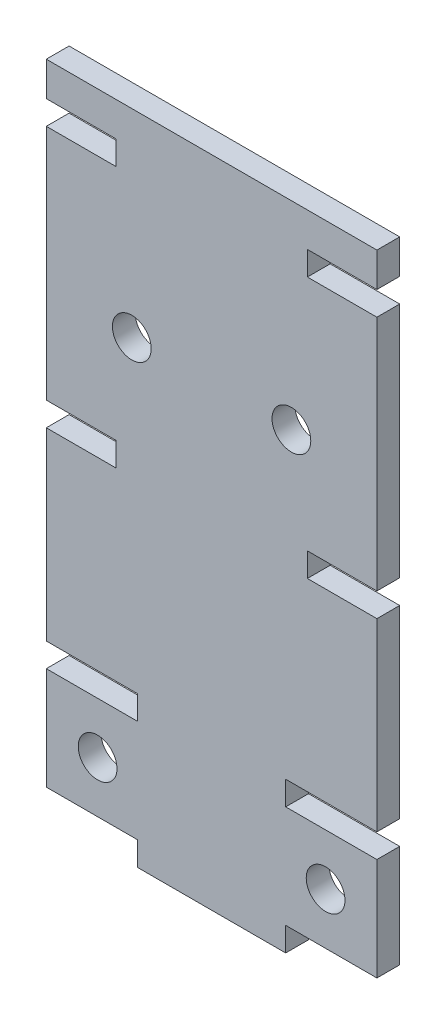
ISO-10303-21;
HEADER;
FILE_DESCRIPTION(('STEP AP214'),'2;1');
FILE_NAME('part.step','',(''),(''),'','','');
FILE_SCHEMA(('AUTOMOTIVE_DESIGN { 1 0 10303 214 1 1 1 1 }'));
ENDSEC;
DATA;
#1=APPLICATION_CONTEXT('core data for automotive mechanical design processes');
#2=APPLICATION_PROTOCOL_DEFINITION('international standard','automotive_design',2000,#1);
#3=PRODUCT_CONTEXT('',#1,'mechanical');
#4=PRODUCT('Part','Part','',(#3));
#5=PRODUCT_RELATED_PRODUCT_CATEGORY('part','',(#4));
#6=PRODUCT_DEFINITION_FORMATION('','',#4);
#7=PRODUCT_DEFINITION_CONTEXT('part definition',#1,'design');
#8=PRODUCT_DEFINITION('design','',#6,#7);
#9=PRODUCT_DEFINITION_SHAPE('','',#8);
#10=(LENGTH_UNIT() NAMED_UNIT(*) SI_UNIT(.MILLI.,.METRE.));
#11=(NAMED_UNIT(*) PLANE_ANGLE_UNIT() SI_UNIT($,.RADIAN.));
#12=(NAMED_UNIT(*) SI_UNIT($,.STERADIAN.) SOLID_ANGLE_UNIT());
#13=UNCERTAINTY_MEASURE_WITH_UNIT(LENGTH_MEASURE(1.E-05),#10,'distance_accuracy_value','');
#14=(GEOMETRIC_REPRESENTATION_CONTEXT(3) GLOBAL_UNCERTAINTY_ASSIGNED_CONTEXT((#13)) GLOBAL_UNIT_ASSIGNED_CONTEXT((#10,
#11,#12)) REPRESENTATION_CONTEXT('',''));
#15=CARTESIAN_POINT('',(0.,0.,0.));
#16=DIRECTION('',(0.,0.,1.));
#17=DIRECTION('',(1.,0.,0.));
#18=AXIS2_PLACEMENT_3D('',#15,#16,#17);
#19=CARTESIAN_POINT('',(0.,39.1,2.));
#20=DIRECTION('',(0.,-1.,0.));
#21=DIRECTION('',(1.,0.,0.));
#22=AXIS2_PLACEMENT_3D('',#19,#20,#21);
#23=PLANE('',#22);
#24=DIRECTION('',(0.,0.,1.));
#25=VECTOR('',#24,1.);
#26=CARTESIAN_POINT('',(6.09999999999999,39.1,0.));
#27=LINE('',#26,#25);
#28=CARTESIAN_POINT('',(6.09999999999999,39.1,0.));
#29=VERTEX_POINT('',#28);
#30=CARTESIAN_POINT('',(6.09999999999999,39.1,2.));
#31=VERTEX_POINT('',#30);
#32=EDGE_CURVE('E317',#29,#31,#27,.T.);
#33=ORIENTED_EDGE('',*,*,#32,.F.);
#34=DIRECTION('',(-1.,0.,0.));
#35=VECTOR('',#34,1.);
#36=CARTESIAN_POINT('',(0.,39.1,0.));
#37=LINE('',#36,#35);
#38=CARTESIAN_POINT('',(0.,39.1,0.));
#39=VERTEX_POINT('',#38);
#40=EDGE_CURVE('E280',#29,#39,#37,.T.);
#41=ORIENTED_EDGE('',*,*,#40,.T.);
#42=DIRECTION('',(0.,0.,-1.));
#43=VECTOR('',#42,1.);
#44=CARTESIAN_POINT('',(0.,39.1,2.));
#45=LINE('',#44,#43);
#46=CARTESIAN_POINT('',(0.,39.1,2.));
#47=VERTEX_POINT('',#46);
#48=EDGE_CURVE('E288',#47,#39,#45,.T.);
#49=ORIENTED_EDGE('',*,*,#48,.F.);
#50=DIRECTION('',(-1.,0.,0.));
#51=VECTOR('',#50,1.);
#52=CARTESIAN_POINT('',(0.,39.1,2.));
#53=LINE('',#52,#51);
#54=EDGE_CURVE('E461',#31,#47,#53,.T.);
#55=ORIENTED_EDGE('',*,*,#54,.F.);
#56=EDGE_LOOP('',(#33,#41,#49,#55));
#57=FACE_BOUND('',#56,.T.);
#58=ADVANCED_FACE('F42',(#57),#23,.F.);
#59=CARTESIAN_POINT('',(0.,0.,2.));
#60=DIRECTION('',(1.,0.,0.));
#61=DIRECTION('',(0.,1.,0.));
#62=AXIS2_PLACEMENT_3D('',#59,#60,#61);
#63=PLANE('',#62);
#64=DIRECTION('',(0.,-1.,0.));
#65=VECTOR('',#64,1.);
#66=CARTESIAN_POINT('',(0.,0.,2.));
#67=LINE('',#66,#65);
#68=CARTESIAN_POINT('',(0.,16.2,2.));
#69=VERTEX_POINT('',#68);
#70=CARTESIAN_POINT('',(0.,0.,2.));
#71=VERTEX_POINT('',#70);
#72=EDGE_CURVE('E279',#69,#71,#67,.T.);
#73=ORIENTED_EDGE('',*,*,#72,.F.);
#74=DIRECTION('',(0.,0.,1.));
#75=VECTOR('',#74,1.);
#76=CARTESIAN_POINT('',(0.,16.2,0.));
#77=LINE('',#76,#75);
#78=CARTESIAN_POINT('',(0.,16.2,0.));
#79=VERTEX_POINT('',#78);
#80=EDGE_CURVE('E422',#79,#69,#77,.T.);
#81=ORIENTED_EDGE('',*,*,#80,.F.);
#82=DIRECTION('',(0.,-1.,0.));
#83=VECTOR('',#82,1.);
#84=CARTESIAN_POINT('',(0.,0.,0.));
#85=LINE('',#84,#83);
#86=CARTESIAN_POINT('',(0.,0.,0.));
#87=VERTEX_POINT('',#86);
#88=EDGE_CURVE('E421',#79,#87,#85,.T.);
#89=ORIENTED_EDGE('',*,*,#88,.T.);
#90=DIRECTION('',(0.,0.,-1.));
#91=VECTOR('',#90,1.);
#92=CARTESIAN_POINT('',(0.,0.,2.));
#93=LINE('',#92,#91);
#94=EDGE_CURVE('E11',#71,#87,#93,.T.);
#95=ORIENTED_EDGE('',*,*,#94,.F.);
#96=EDGE_LOOP('',(#73,#81,#89,#95));
#97=FACE_BOUND('',#96,.T.);
#98=ADVANCED_FACE('F514',(#97),#63,.F.);
#99=CARTESIAN_POINT('',(29.,0.,2.));
#100=DIRECTION('',(-1.,0.,0.));
#101=DIRECTION('',(0.,0.,1.));
#102=AXIS2_PLACEMENT_3D('',#99,#100,#101);
#103=PLANE('',#102);
#104=DIRECTION('',(0.,1.,0.));
#105=VECTOR('',#104,1.);
#106=CARTESIAN_POINT('',(29.,0.,2.));
#107=LINE('',#106,#105);
#108=CARTESIAN_POINT('',(29.,18.3,2.));
#109=VERTEX_POINT('',#108);
#110=CARTESIAN_POINT('',(29.,39.1,2.));
#111=VERTEX_POINT('',#110);
#112=EDGE_CURVE('E462',#109,#111,#107,.T.);
#113=ORIENTED_EDGE('',*,*,#112,.F.);
#114=DIRECTION('',(0.,0.,1.));
#115=VECTOR('',#114,1.);
#116=CARTESIAN_POINT('',(29.,18.3,0.));
#117=LINE('',#116,#115);
#118=CARTESIAN_POINT('',(29.,18.3,0.));
#119=VERTEX_POINT('',#118);
#120=EDGE_CURVE('E385',#119,#109,#117,.T.);
#121=ORIENTED_EDGE('',*,*,#120,.F.);
#122=DIRECTION('',(0.,1.,0.));
#123=VECTOR('',#122,1.);
#124=CARTESIAN_POINT('',(29.,0.,0.));
#125=LINE('',#124,#123);
#126=CARTESIAN_POINT('',(29.,39.1,0.));
#127=VERTEX_POINT('',#126);
#128=EDGE_CURVE('E475',#119,#127,#125,.T.);
#129=ORIENTED_EDGE('',*,*,#128,.T.);
#130=DIRECTION('',(0.,0.,-1.));
#131=VECTOR('',#130,1.);
#132=CARTESIAN_POINT('',(29.,39.1,2.));
#133=LINE('',#132,#131);
#134=EDGE_CURVE('E278',#111,#127,#133,.T.);
#135=ORIENTED_EDGE('',*,*,#134,.F.);
#136=EDGE_LOOP('',(#113,#121,#129,#135));
#137=FACE_BOUND('',#136,.T.);
#138=ADVANCED_FACE('F507',(#137),#103,.F.);
#139=CARTESIAN_POINT('',(0.,18.3,0.));
#140=VERTEX_POINT('',#139);
#141=EDGE_CURVE('E464',#39,#140,#85,.T.);
#142=ORIENTED_EDGE('',*,*,#141,.T.);
#143=DIRECTION('',(0.,0.,1.));
#144=VECTOR('',#143,1.);
#145=CARTESIAN_POINT('',(0.,18.3,0.));
#146=LINE('',#145,#144);
#147=CARTESIAN_POINT('',(0.,18.3,2.));
#148=VERTEX_POINT('',#147);
#149=EDGE_CURVE('E424',#140,#148,#146,.T.);
#150=ORIENTED_EDGE('',*,*,#149,.T.);
#151=EDGE_CURVE('E282',#47,#148,#67,.T.);
#152=ORIENTED_EDGE('',*,*,#151,.F.);
#153=ORIENTED_EDGE('',*,*,#48,.T.);
#154=EDGE_LOOP('',(#142,#150,#152,#153));
#155=FACE_BOUND('',#154,.T.);
#156=ADVANCED_FACE('F44',(#155),#63,.F.);
#157=CARTESIAN_POINT('',(0.,0.,2.));
#158=DIRECTION('',(0.,1.,0.));
#159=DIRECTION('',(-1.,0.,0.));
#160=AXIS2_PLACEMENT_3D('',#157,#158,#159);
#161=PLANE('',#160);
#162=DIRECTION('',(1.,0.,0.));
#163=VECTOR('',#162,1.);
#164=CARTESIAN_POINT('',(0.,0.,0.));
#165=LINE('',#164,#163);
#166=CARTESIAN_POINT('',(8.,0.,0.));
#167=VERTEX_POINT('',#166);
#168=EDGE_CURVE('E467',#87,#167,#165,.T.);
#169=ORIENTED_EDGE('',*,*,#168,.T.);
#170=DIRECTION('',(0.,0.,-1.));
#171=VECTOR('',#170,1.);
#172=CARTESIAN_POINT('',(8.,0.,2.));
#173=LINE('',#172,#171);
#174=CARTESIAN_POINT('',(8.,0.,2.));
#175=VERTEX_POINT('',#174);
#176=EDGE_CURVE('E51',#175,#167,#173,.T.);
#177=ORIENTED_EDGE('',*,*,#176,.F.);
#178=DIRECTION('',(1.,0.,0.));
#179=VECTOR('',#178,1.);
#180=CARTESIAN_POINT('',(0.,0.,2.));
#181=LINE('',#180,#179);
#182=EDGE_CURVE('E451',#71,#175,#181,.T.);
#183=ORIENTED_EDGE('',*,*,#182,.F.);
#184=ORIENTED_EDGE('',*,*,#94,.T.);
#185=EDGE_LOOP('',(#169,#177,#183,#184));
#186=FACE_BOUND('',#185,.T.);
#187=ADVANCED_FACE('F501',(#186),#161,.F.);
#188=CARTESIAN_POINT('',(8.,0.,2.));
#189=DIRECTION('',(1.,0.,0.));
#190=DIRECTION('',(0.,1.,0.));
#191=AXIS2_PLACEMENT_3D('',#188,#189,#190);
#192=PLANE('',#191);
#193=DIRECTION('',(0.,-1.,0.));
#194=VECTOR('',#193,1.);
#195=CARTESIAN_POINT('',(8.,0.,0.));
#196=LINE('',#195,#194);
#197=CARTESIAN_POINT('',(8.,-2.1,0.));
#198=VERTEX_POINT('',#197);
#199=EDGE_CURVE('E469',#167,#198,#196,.T.);
#200=ORIENTED_EDGE('',*,*,#199,.T.);
#201=DIRECTION('',(0.,0.,-1.));
#202=VECTOR('',#201,1.);
#203=CARTESIAN_POINT('',(8.,-2.1,2.));
#204=LINE('',#203,#202);
#205=CARTESIAN_POINT('',(8.,-2.1,2.));
#206=VERTEX_POINT('',#205);
#207=EDGE_CURVE('E300',#206,#198,#204,.T.);
#208=ORIENTED_EDGE('',*,*,#207,.F.);
#209=DIRECTION('',(0.,-1.,0.));
#210=VECTOR('',#209,1.);
#211=CARTESIAN_POINT('',(8.,0.,2.));
#212=LINE('',#211,#210);
#213=EDGE_CURVE('E453',#175,#206,#212,.T.);
#214=ORIENTED_EDGE('',*,*,#213,.F.);
#215=ORIENTED_EDGE('',*,*,#176,.T.);
#216=EDGE_LOOP('',(#200,#208,#214,#215));
#217=FACE_BOUND('',#216,.T.);
#218=ADVANCED_FACE('F508',(#217),#192,.F.);
#219=CARTESIAN_POINT('',(21.,0.,2.));
#220=DIRECTION('',(1.,0.,0.));
#221=DIRECTION('',(0.,0.,-1.));
#222=AXIS2_PLACEMENT_3D('',#219,#220,#221);
#223=PLANE('',#222);
#224=DIRECTION('',(0.,-1.,0.));
#225=VECTOR('',#224,1.);
#226=CARTESIAN_POINT('',(21.,0.,0.));
#227=LINE('',#226,#225);
#228=CARTESIAN_POINT('',(21.,0.,0.));
#229=VERTEX_POINT('',#228);
#230=CARTESIAN_POINT('',(21.,-2.1,0.));
#231=VERTEX_POINT('',#230);
#232=EDGE_CURVE('E471',#229,#231,#227,.T.);
#233=ORIENTED_EDGE('',*,*,#232,.F.);
#234=DIRECTION('',(0.,0.,-1.));
#235=VECTOR('',#234,1.);
#236=CARTESIAN_POINT('',(21.,0.,2.));
#237=LINE('',#236,#235);
#238=CARTESIAN_POINT('',(21.,0.,2.));
#239=VERTEX_POINT('',#238);
#240=EDGE_CURVE('E296',#239,#229,#237,.T.);
#241=ORIENTED_EDGE('',*,*,#240,.F.);
#242=DIRECTION('',(0.,-1.,0.));
#243=VECTOR('',#242,1.);
#244=CARTESIAN_POINT('',(21.,0.,2.));
#245=LINE('',#244,#243);
#246=CARTESIAN_POINT('',(21.,-2.1,2.));
#247=VERTEX_POINT('',#246);
#248=EDGE_CURVE('E456',#239,#247,#245,.T.);
#249=ORIENTED_EDGE('',*,*,#248,.T.);
#250=DIRECTION('',(0.,0.,-1.));
#251=VECTOR('',#250,1.);
#252=CARTESIAN_POINT('',(21.,-2.1,2.));
#253=LINE('',#252,#251);
#254=EDGE_CURVE('E298',#247,#231,#253,.T.);
#255=ORIENTED_EDGE('',*,*,#254,.T.);
#256=EDGE_LOOP('',(#233,#241,#249,#255));
#257=FACE_BOUND('',#256,.T.);
#258=ADVANCED_FACE('F499',(#257),#223,.T.);
#259=CARTESIAN_POINT('',(29.,0.,0.));
#260=VERTEX_POINT('',#259);
#261=EDGE_CURVE('E470',#229,#260,#165,.T.);
#262=ORIENTED_EDGE('',*,*,#261,.T.);
#263=DIRECTION('',(0.,0.,-1.));
#264=VECTOR('',#263,1.);
#265=CARTESIAN_POINT('',(29.,0.,2.));
#266=LINE('',#265,#264);
#267=CARTESIAN_POINT('',(29.,0.,2.));
#268=VERTEX_POINT('',#267);
#269=EDGE_CURVE('E293',#268,#260,#266,.T.);
#270=ORIENTED_EDGE('',*,*,#269,.F.);
#271=EDGE_CURVE('E454',#239,#268,#181,.T.);
#272=ORIENTED_EDGE('',*,*,#271,.F.);
#273=ORIENTED_EDGE('',*,*,#240,.T.);
#274=EDGE_LOOP('',(#262,#270,#272,#273));
#275=FACE_BOUND('',#274,.T.);
#276=ADVANCED_FACE('F497',(#275),#161,.F.);
#277=CARTESIAN_POINT('',(29.,16.2,0.));
#278=VERTEX_POINT('',#277);
#279=EDGE_CURVE('E284',#260,#278,#125,.T.);
#280=ORIENTED_EDGE('',*,*,#279,.T.);
#281=DIRECTION('',(0.,0.,1.));
#282=VECTOR('',#281,1.);
#283=CARTESIAN_POINT('',(29.,16.2,0.));
#284=LINE('',#283,#282);
#285=CARTESIAN_POINT('',(29.,16.2,2.));
#286=VERTEX_POINT('',#285);
#287=EDGE_CURVE('E432',#278,#286,#284,.T.);
#288=ORIENTED_EDGE('',*,*,#287,.T.);
#289=EDGE_CURVE('E458',#268,#286,#107,.T.);
#290=ORIENTED_EDGE('',*,*,#289,.F.);
#291=ORIENTED_EDGE('',*,*,#269,.T.);
#292=EDGE_LOOP('',(#280,#288,#290,#291));
#293=FACE_BOUND('',#292,.T.);
#294=ADVANCED_FACE('F483',(#293),#103,.F.);
#295=CARTESIAN_POINT('',(22.9,39.1,0.));
#296=VERTEX_POINT('',#295);
#297=EDGE_CURVE('E269',#127,#296,#37,.T.);
#298=ORIENTED_EDGE('',*,*,#297,.T.);
#299=DIRECTION('',(0.,0.,1.));
#300=VECTOR('',#299,1.);
#301=CARTESIAN_POINT('',(22.9,39.1,0.));
#302=LINE('',#301,#300);
#303=CARTESIAN_POINT('',(22.9,39.1,2.));
#304=VERTEX_POINT('',#303);
#305=EDGE_CURVE('E251',#296,#304,#302,.T.);
#306=ORIENTED_EDGE('',*,*,#305,.T.);
#307=EDGE_CURVE('E291',#111,#304,#53,.T.);
#308=ORIENTED_EDGE('',*,*,#307,.F.);
#309=ORIENTED_EDGE('',*,*,#134,.T.);
#310=EDGE_LOOP('',(#298,#306,#308,#309));
#311=FACE_BOUND('',#310,.T.);
#312=ADVANCED_FACE('F276',(#311),#23,.F.);
#313=CARTESIAN_POINT('',(0.,0.,2.));
#314=DIRECTION('',(0.,0.,1.));
#315=DIRECTION('',(1.,0.,0.));
#316=AXIS2_PLACEMENT_3D('',#313,#314,#315);
#317=PLANE('',#316);
#318=ORIENTED_EDGE('',*,*,#307,.T.);
#319=DIRECTION('',(0.,1.,0.));
#320=VECTOR('',#319,1.);
#321=CARTESIAN_POINT('',(22.9,39.1,2.));
#322=LINE('',#321,#320);
#323=CARTESIAN_POINT('',(22.9,41.2,2.));
#324=VERTEX_POINT('',#323);
#325=EDGE_CURVE('E59',#304,#324,#322,.T.);
#326=ORIENTED_EDGE('',*,*,#325,.T.);
#327=DIRECTION('',(1.,0.,0.));
#328=VECTOR('',#327,1.);
#329=CARTESIAN_POINT('',(22.9,41.2,2.));
#330=LINE('',#329,#328);
#331=CARTESIAN_POINT('',(29.,41.2,2.));
#332=VERTEX_POINT('',#331);
#333=EDGE_CURVE('E651',#324,#332,#330,.T.);
#334=ORIENTED_EDGE('',*,*,#333,.T.);
#335=DIRECTION('',(0.,1.,0.));
#336=VECTOR('',#335,1.);
#337=CARTESIAN_POINT('',(29.,44.2,2.));
#338=LINE('',#337,#336);
#339=CARTESIAN_POINT('',(29.,44.2,2.));
#340=VERTEX_POINT('',#339);
#341=EDGE_CURVE('E654',#332,#340,#338,.T.);
#342=ORIENTED_EDGE('',*,*,#341,.T.);
#343=DIRECTION('',(-1.,0.,0.));
#344=VECTOR('',#343,1.);
#345=CARTESIAN_POINT('',(0.,44.2,2.));
#346=LINE('',#345,#344);
#347=CARTESIAN_POINT('',(0.,44.2,2.));
#348=VERTEX_POINT('',#347);
#349=EDGE_CURVE('E661',#340,#348,#346,.T.);
#350=ORIENTED_EDGE('',*,*,#349,.T.);
#351=DIRECTION('',(0.,-1.,0.));
#352=VECTOR('',#351,1.);
#353=CARTESIAN_POINT('',(0.,41.2,2.));
#354=LINE('',#353,#352);
#355=CARTESIAN_POINT('',(0.,41.2,2.));
#356=VERTEX_POINT('',#355);
#357=EDGE_CURVE('E636',#348,#356,#354,.T.);
#358=ORIENTED_EDGE('',*,*,#357,.T.);
#359=DIRECTION('',(1.,0.,0.));
#360=VECTOR('',#359,1.);
#361=CARTESIAN_POINT('',(6.09999999999999,41.2,2.));
#362=LINE('',#361,#360);
#363=CARTESIAN_POINT('',(6.09999999999999,41.2,2.));
#364=VERTEX_POINT('',#363);
#365=EDGE_CURVE('E634',#356,#364,#362,.T.);
#366=ORIENTED_EDGE('',*,*,#365,.T.);
#367=DIRECTION('',(0.,-1.,0.));
#368=VECTOR('',#367,1.);
#369=CARTESIAN_POINT('',(6.09999999999999,39.1,2.));
#370=LINE('',#369,#368);
#371=EDGE_CURVE('E273',#364,#31,#370,.T.);
#372=ORIENTED_EDGE('',*,*,#371,.T.);
#373=ORIENTED_EDGE('',*,*,#54,.T.);
#374=ORIENTED_EDGE('',*,*,#151,.T.);
#375=DIRECTION('',(-1.,0.,0.));
#376=VECTOR('',#375,1.);
#377=CARTESIAN_POINT('',(6.09999999999999,18.3,2.));
#378=LINE('',#377,#376);
#379=CARTESIAN_POINT('',(6.09999999999999,18.3,2.));
#380=VERTEX_POINT('',#379);
#381=EDGE_CURVE('E414',#380,#148,#378,.T.);
#382=ORIENTED_EDGE('',*,*,#381,.F.);
#383=DIRECTION('',(0.,1.,0.));
#384=VECTOR('',#383,1.);
#385=CARTESIAN_POINT('',(6.09999999999999,18.3,2.));
#386=LINE('',#385,#384);
#387=CARTESIAN_POINT('',(6.1,16.2,2.));
#388=VERTEX_POINT('',#387);
#389=EDGE_CURVE('E411',#388,#380,#386,.T.);
#390=ORIENTED_EDGE('',*,*,#389,.F.);
#391=DIRECTION('',(1.,0.,0.));
#392=VECTOR('',#391,1.);
#393=CARTESIAN_POINT('',(6.1,16.2,2.));
#394=LINE('',#393,#392);
#395=EDGE_CURVE('E404',#69,#388,#394,.T.);
#396=ORIENTED_EDGE('',*,*,#395,.F.);
#397=ORIENTED_EDGE('',*,*,#72,.T.);
#398=ORIENTED_EDGE('',*,*,#182,.T.);
#399=ORIENTED_EDGE('',*,*,#213,.T.);
#400=DIRECTION('',(-1.,0.,0.));
#401=VECTOR('',#400,1.);
#402=CARTESIAN_POINT('',(21.,-2.1,2.));
#403=LINE('',#402,#401);
#404=CARTESIAN_POINT('',(0.,-2.1,2.));
#405=VERTEX_POINT('',#404);
#406=EDGE_CURVE('E379',#206,#405,#403,.T.);
#407=ORIENTED_EDGE('',*,*,#406,.T.);
#408=DIRECTION('',(0.,-1.,0.));
#409=VECTOR('',#408,1.);
#410=CARTESIAN_POINT('',(0.,-2.1,2.));
#411=LINE('',#410,#409);
#412=CARTESIAN_POINT('',(0.,-11.1,2.));
#413=VERTEX_POINT('',#412);
#414=EDGE_CURVE('E330',#405,#413,#411,.T.);
#415=ORIENTED_EDGE('',*,*,#414,.T.);
#416=DIRECTION('',(1.,0.,0.));
#417=VECTOR('',#416,1.);
#418=CARTESIAN_POINT('',(0.,-11.1,2.));
#419=LINE('',#418,#417);
#420=CARTESIAN_POINT('',(8.,-11.1,2.));
#421=VERTEX_POINT('',#420);
#422=EDGE_CURVE('E361',#413,#421,#419,.T.);
#423=ORIENTED_EDGE('',*,*,#422,.T.);
#424=DIRECTION('',(0.,-1.,0.));
#425=VECTOR('',#424,1.);
#426=CARTESIAN_POINT('',(8.,-11.1,2.));
#427=LINE('',#426,#425);
#428=CARTESIAN_POINT('',(8.,-13.2,2.));
#429=VERTEX_POINT('',#428);
#430=EDGE_CURVE('E364',#421,#429,#427,.T.);
#431=ORIENTED_EDGE('',*,*,#430,.T.);
#432=DIRECTION('',(1.,0.,0.));
#433=VECTOR('',#432,1.);
#434=CARTESIAN_POINT('',(8.,-13.2,2.));
#435=LINE('',#434,#433);
#436=CARTESIAN_POINT('',(21.,-13.2,2.));
#437=VERTEX_POINT('',#436);
#438=EDGE_CURVE('E367',#429,#437,#435,.T.);
#439=ORIENTED_EDGE('',*,*,#438,.T.);
#440=DIRECTION('',(0.,1.,0.));
#441=VECTOR('',#440,1.);
#442=CARTESIAN_POINT('',(21.,-11.1,2.));
#443=LINE('',#442,#441);
#444=CARTESIAN_POINT('',(21.,-11.1,2.));
#445=VERTEX_POINT('',#444);
#446=EDGE_CURVE('E370',#437,#445,#443,.T.);
#447=ORIENTED_EDGE('',*,*,#446,.T.);
#448=DIRECTION('',(1.,0.,0.));
#449=VECTOR('',#448,1.);
#450=CARTESIAN_POINT('',(29.,-11.1,2.));
#451=LINE('',#450,#449);
#452=CARTESIAN_POINT('',(29.,-11.1,2.));
#453=VERTEX_POINT('',#452);
#454=EDGE_CURVE('E373',#445,#453,#451,.T.);
#455=ORIENTED_EDGE('',*,*,#454,.T.);
#456=DIRECTION('',(0.,1.,0.));
#457=VECTOR('',#456,1.);
#458=CARTESIAN_POINT('',(29.,-2.1,2.));
#459=LINE('',#458,#457);
#460=CARTESIAN_POINT('',(29.,-2.1,2.));
#461=VERTEX_POINT('',#460);
#462=EDGE_CURVE('E376',#453,#461,#459,.T.);
#463=ORIENTED_EDGE('',*,*,#462,.T.);
#464=EDGE_CURVE('E380',#461,#247,#403,.T.);
#465=ORIENTED_EDGE('',*,*,#464,.T.);
#466=ORIENTED_EDGE('',*,*,#248,.F.);
#467=ORIENTED_EDGE('',*,*,#271,.T.);
#468=ORIENTED_EDGE('',*,*,#289,.T.);
#469=DIRECTION('',(1.,0.,0.));
#470=VECTOR('',#469,1.);
#471=CARTESIAN_POINT('',(22.9,16.2,2.));
#472=LINE('',#471,#470);
#473=CARTESIAN_POINT('',(22.9,16.2,2.));
#474=VERTEX_POINT('',#473);
#475=EDGE_CURVE('E436',#474,#286,#472,.T.);
#476=ORIENTED_EDGE('',*,*,#475,.F.);
#477=DIRECTION('',(0.,-1.,0.));
#478=VECTOR('',#477,1.);
#479=CARTESIAN_POINT('',(22.9,18.3,2.));
#480=LINE('',#479,#478);
#481=CARTESIAN_POINT('',(22.9,18.3,2.));
#482=VERTEX_POINT('',#481);
#483=EDGE_CURVE('E438',#482,#474,#480,.T.);
#484=ORIENTED_EDGE('',*,*,#483,.F.);
#485=DIRECTION('',(-1.,0.,0.));
#486=VECTOR('',#485,1.);
#487=CARTESIAN_POINT('',(22.9,18.3,2.));
#488=LINE('',#487,#486);
#489=EDGE_CURVE('E415',#109,#482,#488,.T.);
#490=ORIENTED_EDGE('',*,*,#489,.F.);
#491=ORIENTED_EDGE('',*,*,#112,.T.);
#492=EDGE_LOOP('',(#318,#326,#334,#342,#350,#358,#366,#372,#373,#374,#382,#390,#396,#397,#398,
#399,#407,#415,#423,#431,#439,#447,#455,#463,#465,#466,#467,#468,#476,#484,#490,#491));
#493=FACE_BOUND('',#492,.T.);
#494=CARTESIAN_POINT('',(21.5,26.8,2.));
#495=DIRECTION('',(0.,0.,1.));
#496=DIRECTION('',(1.,0.,0.));
#497=AXIS2_PLACEMENT_3D('',#494,#495,#496);
#498=CIRCLE('',#497,1.7);
#499=CARTESIAN_POINT('',(23.2,26.8,2.));
#500=VERTEX_POINT('',#499);
#501=EDGE_CURVE('E306',#500,#500,#498,.T.);
#502=ORIENTED_EDGE('',*,*,#501,.F.);
#503=EDGE_LOOP('',(#502));
#504=FACE_BOUND('',#503,.T.);
#505=CARTESIAN_POINT('',(7.5,26.8,2.));
#506=DIRECTION('',(0.,0.,1.));
#507=DIRECTION('',(-1.,0.,0.));
#508=AXIS2_PLACEMENT_3D('',#505,#506,#507);
#509=CIRCLE('',#508,1.7);
#510=CARTESIAN_POINT('',(5.8,26.8,2.));
#511=VERTEX_POINT('',#510);
#512=EDGE_CURVE('E312',#511,#511,#509,.T.);
#513=ORIENTED_EDGE('',*,*,#512,.F.);
#514=EDGE_LOOP('',(#513));
#515=FACE_BOUND('',#514,.T.);
#516=CARTESIAN_POINT('',(24.5,-6.6,2.));
#517=DIRECTION('',(0.,0.,1.));
#518=DIRECTION('',(-1.,0.,0.));
#519=AXIS2_PLACEMENT_3D('',#516,#517,#518);
#520=CIRCLE('',#519,1.7);
#521=CARTESIAN_POINT('',(22.8,-6.6,2.));
#522=VERTEX_POINT('',#521);
#523=EDGE_CURVE('E310',#522,#522,#520,.T.);
#524=ORIENTED_EDGE('',*,*,#523,.F.);
#525=EDGE_LOOP('',(#524));
#526=FACE_BOUND('',#525,.T.);
#527=CARTESIAN_POINT('',(4.49999999999999,-6.6,2.));
#528=DIRECTION('',(0.,0.,1.));
#529=DIRECTION('',(1.,0.,0.));
#530=AXIS2_PLACEMENT_3D('',#527,#528,#529);
#531=CIRCLE('',#530,1.7);
#532=CARTESIAN_POINT('',(6.19999999999999,-6.6,2.));
#533=VERTEX_POINT('',#532);
#534=EDGE_CURVE('E324',#533,#533,#531,.T.);
#535=ORIENTED_EDGE('',*,*,#534,.F.);
#536=EDGE_LOOP('',(#535));
#537=FACE_BOUND('',#536,.T.);
#538=ADVANCED_FACE('F492',(#493,#504,#515,#526,#537),#317,.T.);
#539=CARTESIAN_POINT('',(0.,0.,0.));
#540=DIRECTION('',(0.,0.,1.));
#541=DIRECTION('',(1.,0.,0.));
#542=AXIS2_PLACEMENT_3D('',#539,#540,#541);
#543=PLANE('',#542);
#544=CARTESIAN_POINT('',(21.5,26.8,0.));
#545=DIRECTION('',(0.,0.,1.));
#546=DIRECTION('',(1.,0.,0.));
#547=AXIS2_PLACEMENT_3D('',#544,#545,#546);
#548=CIRCLE('',#547,1.7);
#549=CARTESIAN_POINT('',(23.2,26.8,0.));
#550=VERTEX_POINT('',#549);
#551=EDGE_CURVE('E46',#550,#550,#548,.T.);
#552=ORIENTED_EDGE('',*,*,#551,.T.);
#553=EDGE_LOOP('',(#552));
#554=FACE_BOUND('',#553,.T.);
#555=CARTESIAN_POINT('',(7.5,26.8,0.));
#556=DIRECTION('',(0.,0.,1.));
#557=DIRECTION('',(1.,0.,0.));
#558=AXIS2_PLACEMENT_3D('',#555,#556,#557);
#559=CIRCLE('',#558,1.7);
#560=CARTESIAN_POINT('',(9.2,26.8,0.));
#561=VERTEX_POINT('',#560);
#562=EDGE_CURVE('E304',#561,#561,#559,.T.);
#563=ORIENTED_EDGE('',*,*,#562,.T.);
#564=EDGE_LOOP('',(#563));
#565=FACE_BOUND('',#564,.T.);
#566=ORIENTED_EDGE('',*,*,#141,.F.);
#567=ORIENTED_EDGE('',*,*,#40,.F.);
#568=DIRECTION('',(0.,-1.,0.));
#569=VECTOR('',#568,1.);
#570=CARTESIAN_POINT('',(6.09999999999999,39.1,0.));
#571=LINE('',#570,#569);
#572=CARTESIAN_POINT('',(6.09999999999999,41.2,0.));
#573=VERTEX_POINT('',#572);
#574=EDGE_CURVE('E260',#573,#29,#571,.T.);
#575=ORIENTED_EDGE('',*,*,#574,.F.);
#576=DIRECTION('',(1.,0.,0.));
#577=VECTOR('',#576,1.);
#578=CARTESIAN_POINT('',(6.09999999999999,41.2,0.));
#579=LINE('',#578,#577);
#580=CARTESIAN_POINT('',(0.,41.2,0.));
#581=VERTEX_POINT('',#580);
#582=EDGE_CURVE('E671',#581,#573,#579,.T.);
#583=ORIENTED_EDGE('',*,*,#582,.F.);
#584=DIRECTION('',(0.,-1.,0.));
#585=VECTOR('',#584,1.);
#586=CARTESIAN_POINT('',(0.,41.2,0.));
#587=LINE('',#586,#585);
#588=CARTESIAN_POINT('',(0.,44.2,0.));
#589=VERTEX_POINT('',#588);
#590=EDGE_CURVE('E669',#589,#581,#587,.T.);
#591=ORIENTED_EDGE('',*,*,#590,.F.);
#592=DIRECTION('',(-1.,0.,0.));
#593=VECTOR('',#592,1.);
#594=CARTESIAN_POINT('',(0.,44.2,0.));
#595=LINE('',#594,#593);
#596=CARTESIAN_POINT('',(29.,44.2,0.));
#597=VERTEX_POINT('',#596);
#598=EDGE_CURVE('E1079',#597,#589,#595,.T.);
#599=ORIENTED_EDGE('',*,*,#598,.F.);
#600=DIRECTION('',(0.,1.,0.));
#601=VECTOR('',#600,1.);
#602=CARTESIAN_POINT('',(29.,44.2,0.));
#603=LINE('',#602,#601);
#604=CARTESIAN_POINT('',(29.,41.2,0.));
#605=VERTEX_POINT('',#604);
#606=EDGE_CURVE('E1084',#605,#597,#603,.T.);
#607=ORIENTED_EDGE('',*,*,#606,.F.);
#608=DIRECTION('',(1.,0.,0.));
#609=VECTOR('',#608,1.);
#610=CARTESIAN_POINT('',(22.9,41.2,0.));
#611=LINE('',#610,#609);
#612=CARTESIAN_POINT('',(22.9,41.2,0.));
#613=VERTEX_POINT('',#612);
#614=EDGE_CURVE('E272',#613,#605,#611,.T.);
#615=ORIENTED_EDGE('',*,*,#614,.F.);
#616=DIRECTION('',(0.,1.,0.));
#617=VECTOR('',#616,1.);
#618=CARTESIAN_POINT('',(22.9,39.1,0.));
#619=LINE('',#618,#617);
#620=EDGE_CURVE('E254',#296,#613,#619,.T.);
#621=ORIENTED_EDGE('',*,*,#620,.F.);
#622=ORIENTED_EDGE('',*,*,#297,.F.);
#623=ORIENTED_EDGE('',*,*,#128,.F.);
#624=DIRECTION('',(-1.,0.,0.));
#625=VECTOR('',#624,1.);
#626=CARTESIAN_POINT('',(22.9,18.3,0.));
#627=LINE('',#626,#625);
#628=CARTESIAN_POINT('',(22.9,18.3,0.));
#629=VERTEX_POINT('',#628);
#630=EDGE_CURVE('E439',#119,#629,#627,.T.);
#631=ORIENTED_EDGE('',*,*,#630,.T.);
#632=DIRECTION('',(0.,-1.,0.));
#633=VECTOR('',#632,1.);
#634=CARTESIAN_POINT('',(22.9,18.3,0.));
#635=LINE('',#634,#633);
#636=CARTESIAN_POINT('',(22.9,16.2,0.));
#637=VERTEX_POINT('',#636);
#638=EDGE_CURVE('E445',#629,#637,#635,.T.);
#639=ORIENTED_EDGE('',*,*,#638,.T.);
#640=DIRECTION('',(1.,0.,0.));
#641=VECTOR('',#640,1.);
#642=CARTESIAN_POINT('',(22.9,16.2,0.));
#643=LINE('',#642,#641);
#644=EDGE_CURVE('E67',#637,#278,#643,.T.);
#645=ORIENTED_EDGE('',*,*,#644,.T.);
#646=ORIENTED_EDGE('',*,*,#279,.F.);
#647=ORIENTED_EDGE('',*,*,#261,.F.);
#648=ORIENTED_EDGE('',*,*,#232,.T.);
#649=DIRECTION('',(-1.,0.,0.));
#650=VECTOR('',#649,1.);
#651=CARTESIAN_POINT('',(8.,-2.1,0.));
#652=LINE('',#651,#650);
#653=CARTESIAN_POINT('',(29.,-2.1,0.));
#654=VERTEX_POINT('',#653);
#655=EDGE_CURVE('E333',#654,#231,#652,.T.);
#656=ORIENTED_EDGE('',*,*,#655,.F.);
#657=DIRECTION('',(0.,1.,0.));
#658=VECTOR('',#657,1.);
#659=CARTESIAN_POINT('',(29.,-2.1,0.));
#660=LINE('',#659,#658);
#661=CARTESIAN_POINT('',(29.,-11.1,0.));
#662=VERTEX_POINT('',#661);
#663=EDGE_CURVE('E355',#662,#654,#660,.T.);
#664=ORIENTED_EDGE('',*,*,#663,.F.);
#665=DIRECTION('',(1.,0.,0.));
#666=VECTOR('',#665,1.);
#667=CARTESIAN_POINT('',(29.,-11.1,0.));
#668=LINE('',#667,#666);
#669=CARTESIAN_POINT('',(21.,-11.1,0.));
#670=VERTEX_POINT('',#669);
#671=EDGE_CURVE('E352',#670,#662,#668,.T.);
#672=ORIENTED_EDGE('',*,*,#671,.F.);
#673=DIRECTION('',(0.,1.,0.));
#674=VECTOR('',#673,1.);
#675=CARTESIAN_POINT('',(21.,-11.1,0.));
#676=LINE('',#675,#674);
#677=CARTESIAN_POINT('',(21.,-13.2,0.));
#678=VERTEX_POINT('',#677);
#679=EDGE_CURVE('E349',#678,#670,#676,.T.);
#680=ORIENTED_EDGE('',*,*,#679,.F.);
#681=DIRECTION('',(1.,0.,0.));
#682=VECTOR('',#681,1.);
#683=CARTESIAN_POINT('',(8.,-13.2,0.));
#684=LINE('',#683,#682);
#685=CARTESIAN_POINT('',(8.,-13.2,0.));
#686=VERTEX_POINT('',#685);
#687=EDGE_CURVE('E346',#686,#678,#684,.T.);
#688=ORIENTED_EDGE('',*,*,#687,.F.);
#689=DIRECTION('',(0.,-1.,0.));
#690=VECTOR('',#689,1.);
#691=CARTESIAN_POINT('',(8.,-11.1,0.));
#692=LINE('',#691,#690);
#693=CARTESIAN_POINT('',(8.,-11.1,0.));
#694=VERTEX_POINT('',#693);
#695=EDGE_CURVE('E343',#694,#686,#692,.T.);
#696=ORIENTED_EDGE('',*,*,#695,.F.);
#697=DIRECTION('',(1.,0.,0.));
#698=VECTOR('',#697,1.);
#699=CARTESIAN_POINT('',(0.,-11.1,0.));
#700=LINE('',#699,#698);
#701=CARTESIAN_POINT('',(0.,-11.1,0.));
#702=VERTEX_POINT('',#701);
#703=EDGE_CURVE('E340',#702,#694,#700,.T.);
#704=ORIENTED_EDGE('',*,*,#703,.F.);
#705=DIRECTION('',(0.,-1.,0.));
#706=VECTOR('',#705,1.);
#707=CARTESIAN_POINT('',(0.,-2.1,0.));
#708=LINE('',#707,#706);
#709=CARTESIAN_POINT('',(0.,-2.1,0.));
#710=VERTEX_POINT('',#709);
#711=EDGE_CURVE('E336',#710,#702,#708,.T.);
#712=ORIENTED_EDGE('',*,*,#711,.F.);
#713=EDGE_CURVE('E337',#198,#710,#652,.T.);
#714=ORIENTED_EDGE('',*,*,#713,.F.);
#715=ORIENTED_EDGE('',*,*,#199,.F.);
#716=ORIENTED_EDGE('',*,*,#168,.F.);
#717=ORIENTED_EDGE('',*,*,#88,.F.);
#718=DIRECTION('',(1.,0.,0.));
#719=VECTOR('',#718,1.);
#720=CARTESIAN_POINT('',(6.1,16.2,0.));
#721=LINE('',#720,#719);
#722=CARTESIAN_POINT('',(6.1,16.2,0.));
#723=VERTEX_POINT('',#722);
#724=EDGE_CURVE('E407',#79,#723,#721,.T.);
#725=ORIENTED_EDGE('',*,*,#724,.T.);
#726=DIRECTION('',(0.,1.,0.));
#727=VECTOR('',#726,1.);
#728=CARTESIAN_POINT('',(6.09999999999999,18.3,0.));
#729=LINE('',#728,#727);
#730=CARTESIAN_POINT('',(6.09999999999999,18.3,0.));
#731=VERTEX_POINT('',#730);
#732=EDGE_CURVE('E400',#723,#731,#729,.T.);
#733=ORIENTED_EDGE('',*,*,#732,.T.);
#734=DIRECTION('',(-1.,0.,0.));
#735=VECTOR('',#734,1.);
#736=CARTESIAN_POINT('',(6.09999999999999,18.3,0.));
#737=LINE('',#736,#735);
#738=EDGE_CURVE('E403',#731,#140,#737,.T.);
#739=ORIENTED_EDGE('',*,*,#738,.T.);
#740=EDGE_LOOP('',(#566,#567,#575,#583,#591,#599,#607,#615,#621,#622,#623,#631,#639,#645,#646,
#647,#648,#656,#664,#672,#680,#688,#696,#704,#712,#714,#715,#716,#717,#725,#733,#739));
#741=FACE_BOUND('',#740,.T.);
#742=CARTESIAN_POINT('',(24.5,-6.6,0.));
#743=DIRECTION('',(0.,0.,1.));
#744=DIRECTION('',(-1.,0.,0.));
#745=AXIS2_PLACEMENT_3D('',#742,#743,#744);
#746=CIRCLE('',#745,1.7);
#747=CARTESIAN_POINT('',(22.8,-6.6,0.));
#748=VERTEX_POINT('',#747);
#749=EDGE_CURVE('E321',#748,#748,#746,.T.);
#750=ORIENTED_EDGE('',*,*,#749,.T.);
#751=EDGE_LOOP('',(#750));
#752=FACE_BOUND('',#751,.T.);
#753=CARTESIAN_POINT('',(4.49999999999999,-6.6,0.));
#754=DIRECTION('',(0.,0.,1.));
#755=DIRECTION('',(1.,0.,0.));
#756=AXIS2_PLACEMENT_3D('',#753,#754,#755);
#757=CIRCLE('',#756,1.7);
#758=CARTESIAN_POINT('',(6.19999999999999,-6.6,0.));
#759=VERTEX_POINT('',#758);
#760=EDGE_CURVE('E327',#759,#759,#757,.T.);
#761=ORIENTED_EDGE('',*,*,#760,.T.);
#762=EDGE_LOOP('',(#761));
#763=FACE_BOUND('',#762,.T.);
#764=ADVANCED_FACE('F266',(#554,#565,#741,#752,#763),#543,.F.);
#765=CARTESIAN_POINT('',(22.9,18.3,0.));
#766=DIRECTION('',(0.,1.,0.));
#767=DIRECTION('',(0.,0.,1.));
#768=AXIS2_PLACEMENT_3D('',#765,#766,#767);
#769=PLANE('',#768);
#770=ORIENTED_EDGE('',*,*,#489,.T.);
#771=DIRECTION('',(0.,0.,1.));
#772=VECTOR('',#771,1.);
#773=CARTESIAN_POINT('',(22.9,18.3,0.));
#774=LINE('',#773,#772);
#775=EDGE_CURVE('E428',#629,#482,#774,.T.);
#776=ORIENTED_EDGE('',*,*,#775,.F.);
#777=ORIENTED_EDGE('',*,*,#630,.F.);
#778=ORIENTED_EDGE('',*,*,#120,.T.);
#779=EDGE_LOOP('',(#770,#776,#777,#778));
#780=FACE_BOUND('',#779,.T.);
#781=ADVANCED_FACE('F531',(#780),#769,.F.);
#782=CARTESIAN_POINT('',(22.9,16.2,0.));
#783=DIRECTION('',(0.,-1.,0.));
#784=DIRECTION('',(0.,0.,-1.));
#785=AXIS2_PLACEMENT_3D('',#782,#783,#784);
#786=PLANE('',#785);
#787=ORIENTED_EDGE('',*,*,#475,.T.);
#788=ORIENTED_EDGE('',*,*,#287,.F.);
#789=ORIENTED_EDGE('',*,*,#644,.F.);
#790=DIRECTION('',(0.,0.,1.));
#791=VECTOR('',#790,1.);
#792=CARTESIAN_POINT('',(22.9,16.2,0.));
#793=LINE('',#792,#791);
#794=EDGE_CURVE('E430',#637,#474,#793,.T.);
#795=ORIENTED_EDGE('',*,*,#794,.T.);
#796=EDGE_LOOP('',(#787,#788,#789,#795));
#797=FACE_BOUND('',#796,.T.);
#798=ADVANCED_FACE('F490',(#797),#786,.F.);
#799=CARTESIAN_POINT('',(22.9,18.3,0.));
#800=DIRECTION('',(-1.,0.,0.));
#801=DIRECTION('',(0.,0.,1.));
#802=AXIS2_PLACEMENT_3D('',#799,#800,#801);
#803=PLANE('',#802);
#804=ORIENTED_EDGE('',*,*,#483,.T.);
#805=ORIENTED_EDGE('',*,*,#794,.F.);
#806=ORIENTED_EDGE('',*,*,#638,.F.);
#807=ORIENTED_EDGE('',*,*,#775,.T.);
#808=EDGE_LOOP('',(#804,#805,#806,#807));
#809=FACE_BOUND('',#808,.T.);
#810=ADVANCED_FACE('F487',(#809),#803,.F.);
#811=CARTESIAN_POINT('',(6.09999999999999,18.3,0.));
#812=DIRECTION('',(1.,0.,0.));
#813=DIRECTION('',(0.,1.,0.));
#814=AXIS2_PLACEMENT_3D('',#811,#812,#813);
#815=PLANE('',#814);
#816=ORIENTED_EDGE('',*,*,#389,.T.);
#817=DIRECTION('',(0.,0.,1.));
#818=VECTOR('',#817,1.);
#819=CARTESIAN_POINT('',(6.09999999999999,18.3,0.));
#820=LINE('',#819,#818);
#821=EDGE_CURVE('E410',#731,#380,#820,.T.);
#822=ORIENTED_EDGE('',*,*,#821,.F.);
#823=ORIENTED_EDGE('',*,*,#732,.F.);
#824=DIRECTION('',(0.,0.,1.));
#825=VECTOR('',#824,1.);
#826=CARTESIAN_POINT('',(6.1,16.2,0.));
#827=LINE('',#826,#825);
#828=EDGE_CURVE('E419',#723,#388,#827,.T.);
#829=ORIENTED_EDGE('',*,*,#828,.T.);
#830=EDGE_LOOP('',(#816,#822,#823,#829));
#831=FACE_BOUND('',#830,.T.);
#832=ADVANCED_FACE('F538',(#831),#815,.F.);
#833=CARTESIAN_POINT('',(6.1,16.2,0.));
#834=DIRECTION('',(0.,-1.,0.));
#835=DIRECTION('',(0.,0.,-1.));
#836=AXIS2_PLACEMENT_3D('',#833,#834,#835);
#837=PLANE('',#836);
#838=ORIENTED_EDGE('',*,*,#395,.T.);
#839=ORIENTED_EDGE('',*,*,#828,.F.);
#840=ORIENTED_EDGE('',*,*,#724,.F.);
#841=ORIENTED_EDGE('',*,*,#80,.T.);
#842=EDGE_LOOP('',(#838,#839,#840,#841));
#843=FACE_BOUND('',#842,.T.);
#844=ADVANCED_FACE('F544',(#843),#837,.F.);
#845=CARTESIAN_POINT('',(6.09999999999999,18.3,0.));
#846=DIRECTION('',(0.,1.,0.));
#847=DIRECTION('',(0.,0.,1.));
#848=AXIS2_PLACEMENT_3D('',#845,#846,#847);
#849=PLANE('',#848);
#850=ORIENTED_EDGE('',*,*,#381,.T.);
#851=ORIENTED_EDGE('',*,*,#149,.F.);
#852=ORIENTED_EDGE('',*,*,#738,.F.);
#853=ORIENTED_EDGE('',*,*,#821,.T.);
#854=EDGE_LOOP('',(#850,#851,#852,#853));
#855=FACE_BOUND('',#854,.T.);
#856=ADVANCED_FACE('F546',(#855),#849,.F.);
#857=CARTESIAN_POINT('',(21.,-2.1,0.));
#858=DIRECTION('',(0.,1.,0.));
#859=DIRECTION('',(0.,0.,1.));
#860=AXIS2_PLACEMENT_3D('',#857,#858,#859);
#861=PLANE('',#860);
#862=ORIENTED_EDGE('',*,*,#254,.F.);
#863=ORIENTED_EDGE('',*,*,#464,.F.);
#864=DIRECTION('',(0.,0.,1.));
#865=VECTOR('',#864,1.);
#866=CARTESIAN_POINT('',(29.,-2.1,0.));
#867=LINE('',#866,#865);
#868=EDGE_CURVE('E383',#654,#461,#867,.T.);
#869=ORIENTED_EDGE('',*,*,#868,.F.);
#870=ORIENTED_EDGE('',*,*,#655,.T.);
#871=EDGE_LOOP('',(#862,#863,#869,#870));
#872=FACE_BOUND('',#871,.T.);
#873=ADVANCED_FACE('F549',(#872),#861,.T.);
#874=ORIENTED_EDGE('',*,*,#406,.F.);
#875=ORIENTED_EDGE('',*,*,#207,.T.);
#876=ORIENTED_EDGE('',*,*,#713,.T.);
#877=DIRECTION('',(0.,0.,1.));
#878=VECTOR('',#877,1.);
#879=CARTESIAN_POINT('',(0.,-2.1,0.));
#880=LINE('',#879,#878);
#881=EDGE_CURVE('E358',#710,#405,#880,.T.);
#882=ORIENTED_EDGE('',*,*,#881,.T.);
#883=EDGE_LOOP('',(#874,#875,#876,#882));
#884=FACE_BOUND('',#883,.T.);
#885=ADVANCED_FACE('F582',(#884),#861,.T.);
#886=CARTESIAN_POINT('',(29.,-2.1,0.));
#887=DIRECTION('',(1.,0.,0.));
#888=DIRECTION('',(0.,1.,0.));
#889=AXIS2_PLACEMENT_3D('',#886,#887,#888);
#890=PLANE('',#889);
#891=ORIENTED_EDGE('',*,*,#462,.F.);
#892=DIRECTION('',(0.,0.,1.));
#893=VECTOR('',#892,1.);
#894=CARTESIAN_POINT('',(29.,-11.1,0.));
#895=LINE('',#894,#893);
#896=EDGE_CURVE('E386',#662,#453,#895,.T.);
#897=ORIENTED_EDGE('',*,*,#896,.F.);
#898=ORIENTED_EDGE('',*,*,#663,.T.);
#899=ORIENTED_EDGE('',*,*,#868,.T.);
#900=EDGE_LOOP('',(#891,#897,#898,#899));
#901=FACE_BOUND('',#900,.T.);
#902=ADVANCED_FACE('F578',(#901),#890,.T.);
#903=CARTESIAN_POINT('',(29.,-11.1,0.));
#904=DIRECTION('',(0.,-1.,0.));
#905=DIRECTION('',(1.,0.,0.));
#906=AXIS2_PLACEMENT_3D('',#903,#904,#905);
#907=PLANE('',#906);
#908=ORIENTED_EDGE('',*,*,#454,.F.);
#909=DIRECTION('',(0.,0.,1.));
#910=VECTOR('',#909,1.);
#911=CARTESIAN_POINT('',(21.,-11.1,0.));
#912=LINE('',#911,#910);
#913=EDGE_CURVE('E388',#670,#445,#912,.T.);
#914=ORIENTED_EDGE('',*,*,#913,.F.);
#915=ORIENTED_EDGE('',*,*,#671,.T.);
#916=ORIENTED_EDGE('',*,*,#896,.T.);
#917=EDGE_LOOP('',(#908,#914,#915,#916));
#918=FACE_BOUND('',#917,.T.);
#919=ADVANCED_FACE('F574',(#918),#907,.T.);
#920=CARTESIAN_POINT('',(21.,-11.1,0.));
#921=DIRECTION('',(1.,0.,0.));
#922=DIRECTION('',(0.,1.,0.));
#923=AXIS2_PLACEMENT_3D('',#920,#921,#922);
#924=PLANE('',#923);
#925=ORIENTED_EDGE('',*,*,#446,.F.);
#926=DIRECTION('',(0.,0.,1.));
#927=VECTOR('',#926,1.);
#928=CARTESIAN_POINT('',(21.,-13.2,0.));
#929=LINE('',#928,#927);
#930=EDGE_CURVE('E390',#678,#437,#929,.T.);
#931=ORIENTED_EDGE('',*,*,#930,.F.);
#932=ORIENTED_EDGE('',*,*,#679,.T.);
#933=ORIENTED_EDGE('',*,*,#913,.T.);
#934=EDGE_LOOP('',(#925,#931,#932,#933));
#935=FACE_BOUND('',#934,.T.);
#936=ADVANCED_FACE('F570',(#935),#924,.T.);
#937=CARTESIAN_POINT('',(8.,-13.2,0.));
#938=DIRECTION('',(0.,-1.,0.));
#939=DIRECTION('',(1.,0.,0.));
#940=AXIS2_PLACEMENT_3D('',#937,#938,#939);
#941=PLANE('',#940);
#942=ORIENTED_EDGE('',*,*,#438,.F.);
#943=DIRECTION('',(0.,0.,1.));
#944=VECTOR('',#943,1.);
#945=CARTESIAN_POINT('',(8.,-13.2,0.));
#946=LINE('',#945,#944);
#947=EDGE_CURVE('E392',#686,#429,#946,.T.);
#948=ORIENTED_EDGE('',*,*,#947,.F.);
#949=ORIENTED_EDGE('',*,*,#687,.T.);
#950=ORIENTED_EDGE('',*,*,#930,.T.);
#951=EDGE_LOOP('',(#942,#948,#949,#950));
#952=FACE_BOUND('',#951,.T.);
#953=ADVANCED_FACE('F566',(#952),#941,.T.);
#954=CARTESIAN_POINT('',(8.,-11.1,0.));
#955=DIRECTION('',(-1.,0.,0.));
#956=DIRECTION('',(0.,-1.,0.));
#957=AXIS2_PLACEMENT_3D('',#954,#955,#956);
#958=PLANE('',#957);
#959=ORIENTED_EDGE('',*,*,#430,.F.);
#960=DIRECTION('',(0.,0.,1.));
#961=VECTOR('',#960,1.);
#962=CARTESIAN_POINT('',(8.,-11.1,0.));
#963=LINE('',#962,#961);
#964=EDGE_CURVE('E394',#694,#421,#963,.T.);
#965=ORIENTED_EDGE('',*,*,#964,.F.);
#966=ORIENTED_EDGE('',*,*,#695,.T.);
#967=ORIENTED_EDGE('',*,*,#947,.T.);
#968=EDGE_LOOP('',(#959,#965,#966,#967));
#969=FACE_BOUND('',#968,.T.);
#970=ADVANCED_FACE('F562',(#969),#958,.T.);
#971=CARTESIAN_POINT('',(0.,-11.1,0.));
#972=DIRECTION('',(0.,-1.,0.));
#973=DIRECTION('',(1.,0.,0.));
#974=AXIS2_PLACEMENT_3D('',#971,#972,#973);
#975=PLANE('',#974);
#976=ORIENTED_EDGE('',*,*,#422,.F.);
#977=DIRECTION('',(0.,0.,1.));
#978=VECTOR('',#977,1.);
#979=CARTESIAN_POINT('',(0.,-11.1,0.));
#980=LINE('',#979,#978);
#981=EDGE_CURVE('E396',#702,#413,#980,.T.);
#982=ORIENTED_EDGE('',*,*,#981,.F.);
#983=ORIENTED_EDGE('',*,*,#703,.T.);
#984=ORIENTED_EDGE('',*,*,#964,.T.);
#985=EDGE_LOOP('',(#976,#982,#983,#984));
#986=FACE_BOUND('',#985,.T.);
#987=ADVANCED_FACE('F558',(#986),#975,.T.);
#988=CARTESIAN_POINT('',(0.,-2.1,0.));
#989=DIRECTION('',(-1.,0.,0.));
#990=DIRECTION('',(0.,-1.,0.));
#991=AXIS2_PLACEMENT_3D('',#988,#989,#990);
#992=PLANE('',#991);
#993=ORIENTED_EDGE('',*,*,#414,.F.);
#994=ORIENTED_EDGE('',*,*,#881,.F.);
#995=ORIENTED_EDGE('',*,*,#711,.T.);
#996=ORIENTED_EDGE('',*,*,#981,.T.);
#997=EDGE_LOOP('',(#993,#994,#995,#996));
#998=FACE_BOUND('',#997,.T.);
#999=ADVANCED_FACE('F554',(#998),#992,.T.);
#1000=CARTESIAN_POINT('',(4.49999999999999,-6.6,0.));
#1001=DIRECTION('',(0.,0.,1.));
#1002=DIRECTION('',(1.,0.,0.));
#1003=AXIS2_PLACEMENT_3D('',#1000,#1001,#1002);
#1004=CYLINDRICAL_SURFACE('',#1003,1.7);
#1005=ORIENTED_EDGE('',*,*,#760,.F.);
#1006=EDGE_LOOP('',(#1005));
#1007=FACE_BOUND('',#1006,.T.);
#1008=ORIENTED_EDGE('',*,*,#534,.T.);
#1009=EDGE_LOOP('',(#1008));
#1010=FACE_BOUND('',#1009,.T.);
#1011=ADVANCED_FACE('F557',(#1007,#1010),#1004,.F.);
#1012=CARTESIAN_POINT('',(24.5,-6.6,0.));
#1013=DIRECTION('',(0.,0.,1.));
#1014=DIRECTION('',(1.,0.,0.));
#1015=AXIS2_PLACEMENT_3D('',#1012,#1013,#1014);
#1016=CYLINDRICAL_SURFACE('',#1015,1.7);
#1017=ORIENTED_EDGE('',*,*,#749,.F.);
#1018=EDGE_LOOP('',(#1017));
#1019=FACE_BOUND('',#1018,.T.);
#1020=ORIENTED_EDGE('',*,*,#523,.T.);
#1021=EDGE_LOOP('',(#1020));
#1022=FACE_BOUND('',#1021,.T.);
#1023=ADVANCED_FACE('F589',(#1019,#1022),#1016,.F.);
#1024=CARTESIAN_POINT('',(7.5,26.8,-8.));
#1025=DIRECTION('',(0.,0.,1.));
#1026=DIRECTION('',(1.,0.,0.));
#1027=AXIS2_PLACEMENT_3D('',#1024,#1025,#1026);
#1028=CYLINDRICAL_SURFACE('',#1027,1.7);
#1029=ORIENTED_EDGE('',*,*,#512,.T.);
#1030=EDGE_LOOP('',(#1029));
#1031=FACE_BOUND('',#1030,.T.);
#1032=ORIENTED_EDGE('',*,*,#562,.F.);
#1033=EDGE_LOOP('',(#1032));
#1034=FACE_BOUND('',#1033,.T.);
#1035=ADVANCED_FACE('F593',(#1031,#1034),#1028,.F.);
#1036=CARTESIAN_POINT('',(21.5,26.8,-8.));
#1037=DIRECTION('',(0.,0.,1.));
#1038=DIRECTION('',(1.,0.,0.));
#1039=AXIS2_PLACEMENT_3D('',#1036,#1037,#1038);
#1040=CYLINDRICAL_SURFACE('',#1039,1.7);
#1041=ORIENTED_EDGE('',*,*,#501,.T.);
#1042=EDGE_LOOP('',(#1041));
#1043=FACE_BOUND('',#1042,.T.);
#1044=ORIENTED_EDGE('',*,*,#551,.F.);
#1045=EDGE_LOOP('',(#1044));
#1046=FACE_BOUND('',#1045,.T.);
#1047=ADVANCED_FACE('F597',(#1043,#1046),#1040,.F.);
#1048=CARTESIAN_POINT('',(6.09999999999999,39.1,0.));
#1049=DIRECTION('',(-1.,0.,0.));
#1050=DIRECTION('',(0.,0.,1.));
#1051=AXIS2_PLACEMENT_3D('',#1048,#1049,#1050);
#1052=PLANE('',#1051);
#1053=ORIENTED_EDGE('',*,*,#371,.F.);
#1054=DIRECTION('',(0.,0.,1.));
#1055=VECTOR('',#1054,1.);
#1056=CARTESIAN_POINT('',(6.09999999999999,41.2,0.));
#1057=LINE('',#1056,#1055);
#1058=EDGE_CURVE('E630',#573,#364,#1057,.T.);
#1059=ORIENTED_EDGE('',*,*,#1058,.F.);
#1060=ORIENTED_EDGE('',*,*,#574,.T.);
#1061=ORIENTED_EDGE('',*,*,#32,.T.);
#1062=EDGE_LOOP('',(#1053,#1059,#1060,#1061));
#1063=FACE_BOUND('',#1062,.T.);
#1064=ADVANCED_FACE('F601',(#1063),#1052,.T.);
#1065=CARTESIAN_POINT('',(6.09999999999999,41.2,0.));
#1066=DIRECTION('',(0.,-1.,0.));
#1067=DIRECTION('',(0.,0.,-1.));
#1068=AXIS2_PLACEMENT_3D('',#1065,#1066,#1067);
#1069=PLANE('',#1068);
#1070=ORIENTED_EDGE('',*,*,#365,.F.);
#1071=DIRECTION('',(0.,0.,1.));
#1072=VECTOR('',#1071,1.);
#1073=CARTESIAN_POINT('',(0.,41.2,0.));
#1074=LINE('',#1073,#1072);
#1075=EDGE_CURVE('E642',#581,#356,#1074,.T.);
#1076=ORIENTED_EDGE('',*,*,#1075,.F.);
#1077=ORIENTED_EDGE('',*,*,#582,.T.);
#1078=ORIENTED_EDGE('',*,*,#1058,.T.);
#1079=EDGE_LOOP('',(#1070,#1076,#1077,#1078));
#1080=FACE_BOUND('',#1079,.T.);
#1081=ADVANCED_FACE('F619',(#1080),#1069,.T.);
#1082=CARTESIAN_POINT('',(0.,41.2,0.));
#1083=DIRECTION('',(-1.,0.,0.));
#1084=DIRECTION('',(0.,0.,1.));
#1085=AXIS2_PLACEMENT_3D('',#1082,#1083,#1084);
#1086=PLANE('',#1085);
#1087=ORIENTED_EDGE('',*,*,#357,.F.);
#1088=DIRECTION('',(0.,0.,1.));
#1089=VECTOR('',#1088,1.);
#1090=CARTESIAN_POINT('',(0.,44.2,0.));
#1091=LINE('',#1090,#1089);
#1092=EDGE_CURVE('E644',#589,#348,#1091,.T.);
#1093=ORIENTED_EDGE('',*,*,#1092,.F.);
#1094=ORIENTED_EDGE('',*,*,#590,.T.);
#1095=ORIENTED_EDGE('',*,*,#1075,.T.);
#1096=EDGE_LOOP('',(#1087,#1093,#1094,#1095));
#1097=FACE_BOUND('',#1096,.T.);
#1098=ADVANCED_FACE('F615',(#1097),#1086,.T.);
#1099=CARTESIAN_POINT('',(0.,44.2,0.));
#1100=DIRECTION('',(0.,1.,0.));
#1101=DIRECTION('',(-1.,0.,0.));
#1102=AXIS2_PLACEMENT_3D('',#1099,#1100,#1101);
#1103=PLANE('',#1102);
#1104=ORIENTED_EDGE('',*,*,#349,.F.);
#1105=DIRECTION('',(0.,0.,1.));
#1106=VECTOR('',#1105,1.);
#1107=CARTESIAN_POINT('',(29.,44.2,0.));
#1108=LINE('',#1107,#1106);
#1109=EDGE_CURVE('E646',#597,#340,#1108,.T.);
#1110=ORIENTED_EDGE('',*,*,#1109,.F.);
#1111=ORIENTED_EDGE('',*,*,#598,.T.);
#1112=ORIENTED_EDGE('',*,*,#1092,.T.);
#1113=EDGE_LOOP('',(#1104,#1110,#1111,#1112));
#1114=FACE_BOUND('',#1113,.T.);
#1115=ADVANCED_FACE('F611',(#1114),#1103,.T.);
#1116=CARTESIAN_POINT('',(29.,44.2,0.));
#1117=DIRECTION('',(1.,0.,0.));
#1118=DIRECTION('',(0.,0.,-1.));
#1119=AXIS2_PLACEMENT_3D('',#1116,#1117,#1118);
#1120=PLANE('',#1119);
#1121=ORIENTED_EDGE('',*,*,#341,.F.);
#1122=DIRECTION('',(0.,0.,1.));
#1123=VECTOR('',#1122,1.);
#1124=CARTESIAN_POINT('',(29.,41.2,0.));
#1125=LINE('',#1124,#1123);
#1126=EDGE_CURVE('E648',#605,#332,#1125,.T.);
#1127=ORIENTED_EDGE('',*,*,#1126,.F.);
#1128=ORIENTED_EDGE('',*,*,#606,.T.);
#1129=ORIENTED_EDGE('',*,*,#1109,.T.);
#1130=EDGE_LOOP('',(#1121,#1127,#1128,#1129));
#1131=FACE_BOUND('',#1130,.T.);
#1132=ADVANCED_FACE('F607',(#1131),#1120,.T.);
#1133=CARTESIAN_POINT('',(22.9,41.2,0.));
#1134=DIRECTION('',(0.,-1.,0.));
#1135=DIRECTION('',(0.,0.,-1.));
#1136=AXIS2_PLACEMENT_3D('',#1133,#1134,#1135);
#1137=PLANE('',#1136);
#1138=ORIENTED_EDGE('',*,*,#333,.F.);
#1139=DIRECTION('',(0.,0.,1.));
#1140=VECTOR('',#1139,1.);
#1141=CARTESIAN_POINT('',(22.9,41.2,0.));
#1142=LINE('',#1141,#1140);
#1143=EDGE_CURVE('E259',#613,#324,#1142,.T.);
#1144=ORIENTED_EDGE('',*,*,#1143,.F.);
#1145=ORIENTED_EDGE('',*,*,#614,.T.);
#1146=ORIENTED_EDGE('',*,*,#1126,.T.);
#1147=EDGE_LOOP('',(#1138,#1144,#1145,#1146));
#1148=FACE_BOUND('',#1147,.T.);
#1149=ADVANCED_FACE('F604',(#1148),#1137,.T.);
#1150=CARTESIAN_POINT('',(22.9,39.1,0.));
#1151=DIRECTION('',(1.,0.,0.));
#1152=DIRECTION('',(0.,0.,-1.));
#1153=AXIS2_PLACEMENT_3D('',#1150,#1151,#1152);
#1154=PLANE('',#1153);
#1155=ORIENTED_EDGE('',*,*,#325,.F.);
#1156=ORIENTED_EDGE('',*,*,#305,.F.);
#1157=ORIENTED_EDGE('',*,*,#620,.T.);
#1158=ORIENTED_EDGE('',*,*,#1143,.T.);
#1159=EDGE_LOOP('',(#1155,#1156,#1157,#1158));
#1160=FACE_BOUND('',#1159,.T.);
#1161=ADVANCED_FACE('F253',(#1160),#1154,.T.);
#1162=CLOSED_SHELL('',(#58,#98,#138,#156,#187,#218,#258,#276,#294,#312,#538,#764,#781,#798,#810,
#832,#844,#856,#873,#885,#902,#919,#936,#953,#970,#987,#999,#1011,#1023,#1035,#1047,#1064,#1081,
#1098,#1115,#1132,#1149,#1161));
#1163=MANIFOLD_SOLID_BREP('B2',#1162);
#1164=ADVANCED_BREP_SHAPE_REPRESENTATION('',(#18,#1163),#14);
#1165=SHAPE_DEFINITION_REPRESENTATION(#9,#1164);
ENDSEC;
END-ISO-10303-21;
